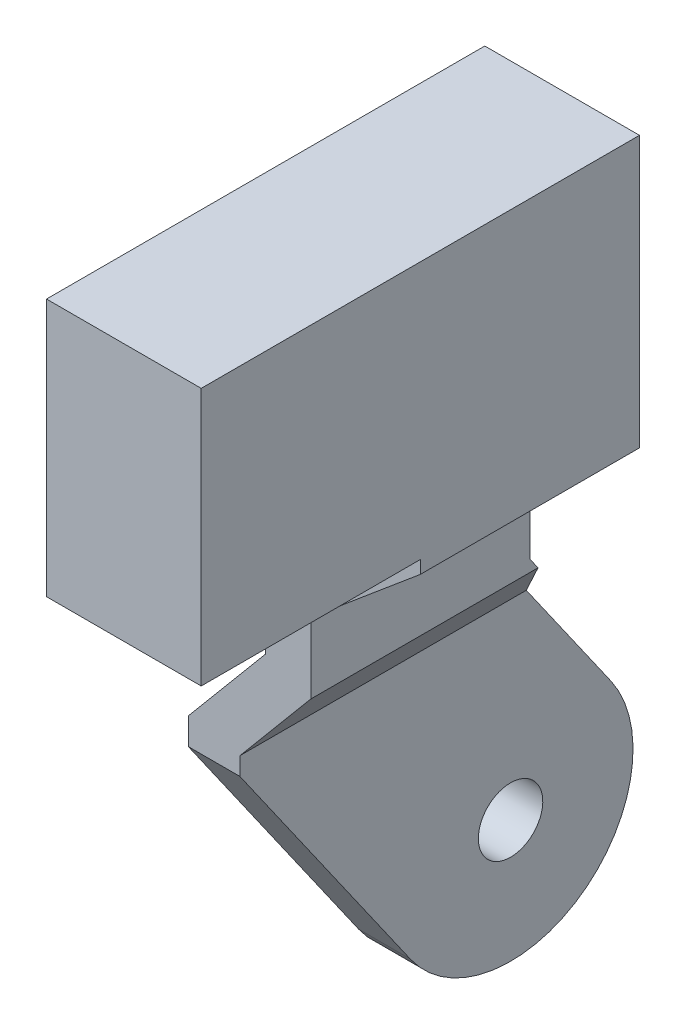
ISO-10303-21;
HEADER;
FILE_DESCRIPTION(('STEP AP214'),'2;1');
FILE_NAME('part.step','',(''),(''),'','','');
FILE_SCHEMA(('AUTOMOTIVE_DESIGN { 1 0 10303 214 1 1 1 1 }'));
ENDSEC;
DATA;
#1=APPLICATION_CONTEXT('core data for automotive mechanical design processes');
#2=APPLICATION_PROTOCOL_DEFINITION('international standard','automotive_design',2000,#1);
#3=PRODUCT_CONTEXT('',#1,'mechanical');
#4=PRODUCT('Part','Part','',(#3));
#5=PRODUCT_RELATED_PRODUCT_CATEGORY('part','',(#4));
#6=PRODUCT_DEFINITION_FORMATION('','',#4);
#7=PRODUCT_DEFINITION_CONTEXT('part definition',#1,'design');
#8=PRODUCT_DEFINITION('design','',#6,#7);
#9=PRODUCT_DEFINITION_SHAPE('','',#8);
#10=(LENGTH_UNIT() NAMED_UNIT(*) SI_UNIT(.MILLI.,.METRE.));
#11=(NAMED_UNIT(*) PLANE_ANGLE_UNIT() SI_UNIT($,.RADIAN.));
#12=(NAMED_UNIT(*) SI_UNIT($,.STERADIAN.) SOLID_ANGLE_UNIT());
#13=UNCERTAINTY_MEASURE_WITH_UNIT(LENGTH_MEASURE(1.E-05),#10,'distance_accuracy_value','');
#14=(GEOMETRIC_REPRESENTATION_CONTEXT(3) GLOBAL_UNCERTAINTY_ASSIGNED_CONTEXT((#13)) GLOBAL_UNIT_ASSIGNED_CONTEXT((#10,
#11,#12)) REPRESENTATION_CONTEXT('',''));
#15=CARTESIAN_POINT('',(0.,0.,0.));
#16=DIRECTION('',(0.,0.,1.));
#17=DIRECTION('',(1.,0.,0.));
#18=AXIS2_PLACEMENT_3D('',#15,#16,#17);
#19=CARTESIAN_POINT('',(20.,226.505215555653,-225.));
#20=DIRECTION('',(-1.,0.,0.));
#21=DIRECTION('',(0.,0.,1.));
#22=AXIS2_PLACEMENT_3D('',#19,#20,#21);
#23=PLANE('',#22);
#24=DIRECTION('',(0.,-1.,0.));
#25=VECTOR('',#24,1.);
#26=CARTESIAN_POINT('',(20.,350.,210.));
#27=LINE('',#26,#25);
#28=CARTESIAN_POINT('',(20.,350.,210.));
#29=VERTEX_POINT('',#28);
#30=CARTESIAN_POINT('',(20.,226.505215555653,210.));
#31=VERTEX_POINT('',#30);
#32=EDGE_CURVE('E52',#29,#31,#27,.T.);
#33=ORIENTED_EDGE('',*,*,#32,.F.);
#34=DIRECTION('',(0.,0.,-1.));
#35=VECTOR('',#34,1.);
#36=CARTESIAN_POINT('',(20.,350.,380.));
#37=LINE('',#36,#35);
#38=CARTESIAN_POINT('',(20.,350.,380.));
#39=VERTEX_POINT('',#38);
#40=EDGE_CURVE('E60',#39,#29,#37,.T.);
#41=ORIENTED_EDGE('',*,*,#40,.F.);
#42=DIRECTION('',(0.,-1.,0.));
#43=VECTOR('',#42,1.);
#44=CARTESIAN_POINT('',(20.,550.,380.));
#45=LINE('',#44,#43);
#46=CARTESIAN_POINT('',(20.,550.,380.));
#47=VERTEX_POINT('',#46);
#48=EDGE_CURVE('E314',#47,#39,#45,.T.);
#49=ORIENTED_EDGE('',*,*,#48,.F.);
#50=DIRECTION('',(0.,0.,1.));
#51=VECTOR('',#50,1.);
#52=CARTESIAN_POINT('',(20.,550.,-225.));
#53=LINE('',#52,#51);
#54=CARTESIAN_POINT('',(20.,550.,40.));
#55=VERTEX_POINT('',#54);
#56=EDGE_CURVE('E330',#55,#47,#53,.T.);
#57=ORIENTED_EDGE('',*,*,#56,.F.);
#58=DIRECTION('',(0.,1.,0.));
#59=VECTOR('',#58,1.);
#60=CARTESIAN_POINT('',(20.,222.753365853687,40.));
#61=LINE('',#60,#59);
#62=CARTESIAN_POINT('',(20.,226.505215555653,40.));
#63=VERTEX_POINT('',#62);
#64=EDGE_CURVE('E12',#63,#55,#61,.T.);
#65=ORIENTED_EDGE('',*,*,#64,.F.);
#66=DIRECTION('',(0.,0.,1.));
#67=VECTOR('',#66,1.);
#68=CARTESIAN_POINT('',(20.,226.505215555653,-225.));
#69=LINE('',#68,#67);
#70=EDGE_CURVE('E328',#63,#31,#69,.T.);
#71=ORIENTED_EDGE('',*,*,#70,.T.);
#72=EDGE_LOOP('',(#33,#41,#49,#57,#65,#71));
#73=FACE_BOUND('',#72,.T.);
#74=CARTESIAN_POINT('',(20.,260.,85.0000000000025));
#75=DIRECTION('',(-1.,0.,0.));
#76=DIRECTION('',(0.,0.,1.));
#77=AXIS2_PLACEMENT_3D('',#74,#75,#76);
#78=CIRCLE('',#77,10.);
#79=CARTESIAN_POINT('',(20.,260.,95.0000000000025));
#80=VERTEX_POINT('',#79);
#81=EDGE_CURVE('E39',#80,#80,#78,.T.);
#82=ORIENTED_EDGE('',*,*,#81,.F.);
#83=EDGE_LOOP('',(#82));
#84=FACE_BOUND('',#83,.T.);
#85=ADVANCED_FACE('F35',(#73,#84),#23,.T.);
#86=CARTESIAN_POINT('',(-40.,0.,0.));
#87=DIRECTION('',(1.,0.,0.));
#88=DIRECTION('',(0.,0.,-1.));
#89=AXIS2_PLACEMENT_3D('',#86,#87,#88);
#90=CYLINDRICAL_SURFACE('',#89,95.);
#91=DIRECTION('',(1.,0.,0.));
#92=VECTOR('',#91,1.);
#93=CARTESIAN_POINT('',(-40.,54.4897614533498,-77.8194442074539));
#94=LINE('',#93,#92);
#95=CARTESIAN_POINT('',(-40.,54.4897614533498,-77.8194442074539));
#96=VERTEX_POINT('',#95);
#97=CARTESIAN_POINT('',(0.,54.4897614533498,-77.8194442074539));
#98=VERTEX_POINT('',#97);
#99=EDGE_CURVE('E181',#96,#98,#94,.T.);
#100=ORIENTED_EDGE('',*,*,#99,.T.);
#101=CARTESIAN_POINT('',(0.,0.,0.));
#102=DIRECTION('',(1.,0.,0.));
#103=DIRECTION('',(0.,1.,0.));
#104=AXIS2_PLACEMENT_3D('',#101,#102,#103);
#105=CIRCLE('',#104,95.);
#106=CARTESIAN_POINT('',(0.,-54.4897614533498,77.8194442074539));
#107=VERTEX_POINT('',#106);
#108=EDGE_CURVE('E299',#98,#107,#105,.F.);
#109=ORIENTED_EDGE('',*,*,#108,.T.);
#110=DIRECTION('',(1.,0.,0.));
#111=VECTOR('',#110,1.);
#112=CARTESIAN_POINT('',(-40.,-54.4897614533498,77.8194442074539));
#113=LINE('',#112,#111);
#114=CARTESIAN_POINT('',(-40.,-54.4897614533498,77.8194442074539));
#115=VERTEX_POINT('',#114);
#116=EDGE_CURVE('E151',#115,#107,#113,.T.);
#117=ORIENTED_EDGE('',*,*,#116,.F.);
#118=CARTESIAN_POINT('',(-40.,0.,0.));
#119=DIRECTION('',(1.,0.,0.));
#120=DIRECTION('',(0.,0.,-1.));
#121=AXIS2_PLACEMENT_3D('',#118,#119,#120);
#122=CIRCLE('',#121,95.);
#123=EDGE_CURVE('E166',#115,#96,#122,.T.);
#124=ORIENTED_EDGE('',*,*,#123,.T.);
#125=EDGE_LOOP('',(#100,#109,#117,#124));
#126=FACE_BOUND('',#125,.T.);
#127=ADVANCED_FACE('F226',(#126),#90,.T.);
#128=CARTESIAN_POINT('',(-40.,134.283635831838,210.));
#129=DIRECTION('',(0.,-0.57357643635105,0.819152044288989));
#130=DIRECTION('',(0.,-0.819152044288989,-0.57357643635105));
#131=AXIS2_PLACEMENT_3D('',#128,#129,#130);
#132=PLANE('',#131);
#133=ORIENTED_EDGE('',*,*,#116,.T.);
#134=DIRECTION('',(0.,0.819152044288989,0.57357643635105));
#135=VECTOR('',#134,1.);
#136=CARTESIAN_POINT('',(0.,134.283635831838,210.));
#137=LINE('',#136,#135);
#138=CARTESIAN_POINT('',(0.,134.283635831838,210.));
#139=VERTEX_POINT('',#138);
#140=EDGE_CURVE('E302',#107,#139,#137,.T.);
#141=ORIENTED_EDGE('',*,*,#140,.T.);
#142=DIRECTION('',(1.,0.,0.));
#143=VECTOR('',#142,1.);
#144=CARTESIAN_POINT('',(-40.,134.283635831838,210.));
#145=LINE('',#144,#143);
#146=CARTESIAN_POINT('',(-40.,134.283635831838,210.));
#147=VERTEX_POINT('',#146);
#148=EDGE_CURVE('E184',#147,#139,#145,.T.);
#149=ORIENTED_EDGE('',*,*,#148,.F.);
#150=DIRECTION('',(0.,-0.819152044288989,-0.57357643635105));
#151=VECTOR('',#150,1.);
#152=CARTESIAN_POINT('',(-40.,134.283635831838,210.));
#153=LINE('',#152,#151);
#154=EDGE_CURVE('E178',#147,#115,#153,.T.);
#155=ORIENTED_EDGE('',*,*,#154,.T.);
#156=EDGE_LOOP('',(#133,#141,#149,#155));
#157=FACE_BOUND('',#156,.T.);
#158=ADVANCED_FACE('F232',(#157),#132,.T.);
#159=CARTESIAN_POINT('',(-40.,350.,210.));
#160=DIRECTION('',(0.,0.,1.));
#161=DIRECTION('',(0.,-1.,0.));
#162=AXIS2_PLACEMENT_3D('',#159,#160,#161);
#163=PLANE('',#162);
#164=ORIENTED_EDGE('',*,*,#32,.T.);
#165=DIRECTION('',(-0.642787609686541,-0.766044443118977,0.));
#166=VECTOR('',#165,1.);
#167=CARTESIAN_POINT('',(56.0187559186903,269.430697322525,210.));
#168=LINE('',#167,#166);
#169=CARTESIAN_POINT('',(-40.,155.,210.));
#170=VERTEX_POINT('',#169);
#171=EDGE_CURVE('E294',#31,#170,#168,.T.);
#172=ORIENTED_EDGE('',*,*,#171,.T.);
#173=DIRECTION('',(0.,-1.,0.));
#174=VECTOR('',#173,1.);
#175=CARTESIAN_POINT('',(-40.,350.,210.));
#176=LINE('',#175,#174);
#177=EDGE_CURVE('E176',#170,#147,#176,.T.);
#178=ORIENTED_EDGE('',*,*,#177,.T.);
#179=ORIENTED_EDGE('',*,*,#148,.T.);
#180=DIRECTION('',(0.,1.,0.));
#181=VECTOR('',#180,1.);
#182=CARTESIAN_POINT('',(0.,350.,210.));
#183=LINE('',#182,#181);
#184=CARTESIAN_POINT('',(0.,148.219809763654,210.));
#185=VERTEX_POINT('',#184);
#186=EDGE_CURVE('E305',#139,#185,#183,.T.);
#187=ORIENTED_EDGE('',*,*,#186,.T.);
#188=DIRECTION('',(0.64278760968654,0.766044443118977,0.));
#189=VECTOR('',#188,1.);
#190=CARTESIAN_POINT('',(82.8303114278545,246.933130983497,210.));
#191=LINE('',#190,#189);
#192=CARTESIAN_POINT('',(55.,213.766257356336,210.));
#193=VERTEX_POINT('',#192);
#194=EDGE_CURVE('E308',#185,#193,#191,.T.);
#195=ORIENTED_EDGE('',*,*,#194,.T.);
#196=DIRECTION('',(0.,1.,0.));
#197=VECTOR('',#196,1.);
#198=CARTESIAN_POINT('',(55.,350.,210.));
#199=LINE('',#198,#197);
#200=CARTESIAN_POINT('',(55.,268.676531349931,210.));
#201=VERTEX_POINT('',#200);
#202=EDGE_CURVE('E158',#193,#201,#199,.T.);
#203=ORIENTED_EDGE('',*,*,#202,.T.);
#204=DIRECTION('',(0.76604444311898,0.642787609686538,0.));
#205=VECTOR('',#204,1.);
#206=CARTESIAN_POINT('',(39.295702775037,255.499061340567,210.));
#207=LINE('',#206,#205);
#208=CARTESIAN_POINT('',(140.,340.,210.));
#209=VERTEX_POINT('',#208);
#210=EDGE_CURVE('E142',#201,#209,#207,.T.);
#211=ORIENTED_EDGE('',*,*,#210,.T.);
#212=DIRECTION('',(0.,-1.,0.));
#213=VECTOR('',#212,1.);
#214=CARTESIAN_POINT('',(140.,350.,210.));
#215=LINE('',#214,#213);
#216=CARTESIAN_POINT('',(140.,350.,210.));
#217=VERTEX_POINT('',#216);
#218=EDGE_CURVE('E156',#217,#209,#215,.T.);
#219=ORIENTED_EDGE('',*,*,#218,.F.);
#220=DIRECTION('',(1.,0.,0.));
#221=VECTOR('',#220,1.);
#222=CARTESIAN_POINT('',(-40.,350.,210.));
#223=LINE('',#222,#221);
#224=EDGE_CURVE('E187',#29,#217,#223,.T.);
#225=ORIENTED_EDGE('',*,*,#224,.F.);
#226=EDGE_LOOP('',(#164,#172,#178,#179,#187,#195,#203,#211,#219,#225));
#227=FACE_BOUND('',#226,.T.);
#228=ADVANCED_FACE('F155',(#227),#163,.T.);
#229=CARTESIAN_POINT('',(-40.,350.,380.));
#230=DIRECTION('',(0.,-1.,0.));
#231=DIRECTION('',(0.,0.,-1.));
#232=AXIS2_PLACEMENT_3D('',#229,#230,#231);
#233=PLANE('',#232);
#234=DIRECTION('',(1.,0.,0.));
#235=VECTOR('',#234,1.);
#236=CARTESIAN_POINT('',(-40.,350.,380.));
#237=LINE('',#236,#235);
#238=CARTESIAN_POINT('',(140.,350.,380.));
#239=VERTEX_POINT('',#238);
#240=EDGE_CURVE('E189',#39,#239,#237,.T.);
#241=ORIENTED_EDGE('',*,*,#240,.F.);
#242=ORIENTED_EDGE('',*,*,#40,.T.);
#243=ORIENTED_EDGE('',*,*,#224,.T.);
#244=DIRECTION('',(0.,0.,-1.));
#245=VECTOR('',#244,1.);
#246=CARTESIAN_POINT('',(140.,350.,380.));
#247=LINE('',#246,#245);
#248=EDGE_CURVE('E165',#239,#217,#247,.T.);
#249=ORIENTED_EDGE('',*,*,#248,.F.);
#250=EDGE_LOOP('',(#241,#242,#243,#249));
#251=FACE_BOUND('',#250,.T.);
#252=ADVANCED_FACE('F264',(#251),#233,.T.);
#253=CARTESIAN_POINT('',(-40.,550.,380.));
#254=DIRECTION('',(0.,0.,1.));
#255=DIRECTION('',(0.,-1.,0.));
#256=AXIS2_PLACEMENT_3D('',#253,#254,#255);
#257=PLANE('',#256);
#258=DIRECTION('',(1.,0.,0.));
#259=VECTOR('',#258,1.);
#260=CARTESIAN_POINT('',(-40.,550.,380.));
#261=LINE('',#260,#259);
#262=CARTESIAN_POINT('',(140.,550.,380.));
#263=VERTEX_POINT('',#262);
#264=EDGE_CURVE('E191',#47,#263,#261,.T.);
#265=ORIENTED_EDGE('',*,*,#264,.F.);
#266=ORIENTED_EDGE('',*,*,#48,.T.);
#267=ORIENTED_EDGE('',*,*,#240,.T.);
#268=DIRECTION('',(0.,-1.,0.));
#269=VECTOR('',#268,1.);
#270=CARTESIAN_POINT('',(140.,550.,380.));
#271=LINE('',#270,#269);
#272=EDGE_CURVE('E170',#263,#239,#271,.T.);
#273=ORIENTED_EDGE('',*,*,#272,.F.);
#274=EDGE_LOOP('',(#265,#266,#267,#273));
#275=FACE_BOUND('',#274,.T.);
#276=ADVANCED_FACE('F267',(#275),#257,.T.);
#277=CARTESIAN_POINT('',(-40.,550.,40.));
#278=DIRECTION('',(0.,1.,0.));
#279=DIRECTION('',(0.,0.,1.));
#280=AXIS2_PLACEMENT_3D('',#277,#278,#279);
#281=PLANE('',#280);
#282=DIRECTION('',(1.,0.,0.));
#283=VECTOR('',#282,1.);
#284=CARTESIAN_POINT('',(-40.,550.,40.));
#285=LINE('',#284,#283);
#286=CARTESIAN_POINT('',(140.,550.,40.));
#287=VERTEX_POINT('',#286);
#288=EDGE_CURVE('E193',#55,#287,#285,.T.);
#289=ORIENTED_EDGE('',*,*,#288,.F.);
#290=ORIENTED_EDGE('',*,*,#56,.T.);
#291=ORIENTED_EDGE('',*,*,#264,.T.);
#292=DIRECTION('',(0.,0.,1.));
#293=VECTOR('',#292,1.);
#294=CARTESIAN_POINT('',(140.,550.,40.));
#295=LINE('',#294,#293);
#296=EDGE_CURVE('E320',#287,#263,#295,.T.);
#297=ORIENTED_EDGE('',*,*,#296,.F.);
#298=EDGE_LOOP('',(#289,#290,#291,#297));
#299=FACE_BOUND('',#298,.T.);
#300=ADVANCED_FACE('F270',(#299),#281,.T.);
#301=CARTESIAN_POINT('',(-40.,222.753365853687,40.));
#302=DIRECTION('',(0.,0.,-1.));
#303=DIRECTION('',(-1.,0.,0.));
#304=AXIS2_PLACEMENT_3D('',#301,#302,#303);
#305=PLANE('',#304);
#306=DIRECTION('',(1.,0.,0.));
#307=VECTOR('',#306,1.);
#308=CARTESIAN_POINT('',(-40.,222.753365853687,40.));
#309=LINE('',#308,#307);
#310=CARTESIAN_POINT('',(16.8518242988482,222.753365853687,40.));
#311=VERTEX_POINT('',#310);
#312=CARTESIAN_POINT('',(55.,222.753365853687,40.));
#313=VERTEX_POINT('',#312);
#314=EDGE_CURVE('E195',#311,#313,#309,.T.);
#315=ORIENTED_EDGE('',*,*,#314,.F.);
#316=DIRECTION('',(0.642787609686541,0.766044443118977,0.));
#317=VECTOR('',#316,1.);
#318=CARTESIAN_POINT('',(-6.63798000730822,194.75930718249,40.));
#319=LINE('',#318,#317);
#320=EDGE_CURVE('E292',#311,#63,#319,.T.);
#321=ORIENTED_EDGE('',*,*,#320,.T.);
#322=ORIENTED_EDGE('',*,*,#64,.T.);
#323=ORIENTED_EDGE('',*,*,#288,.T.);
#324=DIRECTION('',(0.,1.,0.));
#325=VECTOR('',#324,1.);
#326=CARTESIAN_POINT('',(140.,222.753365853687,40.));
#327=LINE('',#326,#325);
#328=CARTESIAN_POINT('',(140.,340.,40.));
#329=VERTEX_POINT('',#328);
#330=EDGE_CURVE('E318',#329,#287,#327,.T.);
#331=ORIENTED_EDGE('',*,*,#330,.F.);
#332=DIRECTION('',(-0.76604444311898,-0.642787609686538,0.));
#333=VECTOR('',#332,1.);
#334=CARTESIAN_POINT('',(-23.3610331509615,202.923817334289,40.));
#335=LINE('',#334,#333);
#336=CARTESIAN_POINT('',(55.,268.676531349931,40.));
#337=VERTEX_POINT('',#336);
#338=EDGE_CURVE('E145',#329,#337,#335,.T.);
#339=ORIENTED_EDGE('',*,*,#338,.T.);
#340=DIRECTION('',(0.,-1.,0.));
#341=VECTOR('',#340,1.);
#342=CARTESIAN_POINT('',(55.,222.753365853687,40.));
#343=LINE('',#342,#341);
#344=EDGE_CURVE('E310',#337,#313,#343,.T.);
#345=ORIENTED_EDGE('',*,*,#344,.T.);
#346=EDGE_LOOP('',(#315,#321,#322,#323,#331,#339,#345));
#347=FACE_BOUND('',#346,.T.);
#348=ADVANCED_FACE('F274',(#347),#305,.T.);
#349=CARTESIAN_POINT('',(-40.,54.4897614533498,-77.8194442074539));
#350=DIRECTION('',(0.,0.57357643635105,-0.819152044288989));
#351=DIRECTION('',(0.,0.819152044288989,0.57357643635105));
#352=AXIS2_PLACEMENT_3D('',#349,#350,#351);
#353=PLANE('',#352);
#354=DIRECTION('',(0.,0.819152044288989,0.57357643635105));
#355=VECTOR('',#354,1.);
#356=CARTESIAN_POINT('',(-40.,54.4897614533498,-77.8194442074539));
#357=LINE('',#356,#355);
#358=CARTESIAN_POINT('',(-40.,155.,-7.44141750983249));
#359=VERTEX_POINT('',#358);
#360=EDGE_CURVE('E168',#96,#359,#357,.T.);
#361=ORIENTED_EDGE('',*,*,#360,.T.);
#362=DIRECTION('',(0.566444979584274,0.67506283942651,0.472684088931698));
#363=VECTOR('',#362,1.);
#364=CARTESIAN_POINT('',(-97.2773871919136,86.7394680396276,-55.2379565506907));
#365=LINE('',#364,#363);
#366=EDGE_CURVE('E159',#359,#311,#365,.T.);
#367=ORIENTED_EDGE('',*,*,#366,.T.);
#368=ORIENTED_EDGE('',*,*,#314,.T.);
#369=DIRECTION('',(0.,-0.819152044288989,-0.57357643635105));
#370=VECTOR('',#369,1.);
#371=CARTESIAN_POINT('',(55.,54.4897614533498,-77.8194442074539));
#372=LINE('',#371,#370);
#373=CARTESIAN_POINT('',(55.,213.766257356336,33.7071588834457));
#374=VERTEX_POINT('',#373);
#375=EDGE_CURVE('E44',#313,#374,#372,.T.);
#376=ORIENTED_EDGE('',*,*,#375,.T.);
#377=DIRECTION('',(-0.566444979584274,-0.67506283942651,-0.472684088931699));
#378=VECTOR('',#377,1.);
#379=CARTESIAN_POINT('',(-66.2479825768863,69.2685385255313,-67.4712330959915));
#380=LINE('',#379,#378);
#381=CARTESIAN_POINT('',(0.,148.219809763654,-12.188957823818));
#382=VERTEX_POINT('',#381);
#383=EDGE_CURVE('E205',#374,#382,#380,.T.);
#384=ORIENTED_EDGE('',*,*,#383,.T.);
#385=DIRECTION('',(0.,-0.819152044288989,-0.57357643635105));
#386=VECTOR('',#385,1.);
#387=CARTESIAN_POINT('',(0.,54.4897614533498,-77.8194442074539));
#388=LINE('',#387,#386);
#389=EDGE_CURVE('E202',#382,#98,#388,.T.);
#390=ORIENTED_EDGE('',*,*,#389,.T.);
#391=ORIENTED_EDGE('',*,*,#99,.F.);
#392=EDGE_LOOP('',(#361,#367,#368,#376,#384,#390,#391));
#393=FACE_BOUND('',#392,.T.);
#394=ADVANCED_FACE('F257',(#393),#353,.T.);
#395=CARTESIAN_POINT('',(-40.,0.,0.));
#396=DIRECTION('',(1.,0.,0.));
#397=DIRECTION('',(0.,0.,-1.));
#398=AXIS2_PLACEMENT_3D('',#395,#396,#397);
#399=PLANE('',#398);
#400=CARTESIAN_POINT('',(-40.,0.,0.));
#401=DIRECTION('',(-1.,0.,0.));
#402=DIRECTION('',(0.,0.,1.));
#403=AXIS2_PLACEMENT_3D('',#400,#401,#402);
#404=CIRCLE('',#403,25.);
#405=CARTESIAN_POINT('',(-40.,0.,25.));
#406=VERTEX_POINT('',#405);
#407=EDGE_CURVE('E212',#406,#406,#404,.T.);
#408=ORIENTED_EDGE('',*,*,#407,.F.);
#409=EDGE_LOOP('',(#408));
#410=FACE_BOUND('',#409,.T.);
#411=DIRECTION('',(0.,0.,1.));
#412=VECTOR('',#411,1.);
#413=CARTESIAN_POINT('',(-40.,155.,0.));
#414=LINE('',#413,#412);
#415=EDGE_CURVE('E150',#359,#170,#414,.T.);
#416=ORIENTED_EDGE('',*,*,#415,.F.);
#417=ORIENTED_EDGE('',*,*,#360,.F.);
#418=ORIENTED_EDGE('',*,*,#123,.F.);
#419=ORIENTED_EDGE('',*,*,#154,.F.);
#420=ORIENTED_EDGE('',*,*,#177,.F.);
#421=EDGE_LOOP('',(#416,#417,#418,#419,#420));
#422=FACE_BOUND('',#421,.T.);
#423=ADVANCED_FACE('F254',(#410,#422),#399,.F.);
#424=CARTESIAN_POINT('',(140.,0.,0.));
#425=DIRECTION('',(1.,0.,0.));
#426=DIRECTION('',(0.,0.,-1.));
#427=AXIS2_PLACEMENT_3D('',#424,#425,#426);
#428=PLANE('',#427);
#429=ORIENTED_EDGE('',*,*,#218,.T.);
#430=DIRECTION('',(0.,0.,-1.));
#431=VECTOR('',#430,1.);
#432=CARTESIAN_POINT('',(140.,340.,0.));
#433=LINE('',#432,#431);
#434=EDGE_CURVE('E138',#209,#329,#433,.T.);
#435=ORIENTED_EDGE('',*,*,#434,.T.);
#436=ORIENTED_EDGE('',*,*,#330,.T.);
#437=ORIENTED_EDGE('',*,*,#296,.T.);
#438=ORIENTED_EDGE('',*,*,#272,.T.);
#439=ORIENTED_EDGE('',*,*,#248,.T.);
#440=EDGE_LOOP('',(#429,#435,#436,#437,#438,#439));
#441=FACE_BOUND('',#440,.T.);
#442=ADVANCED_FACE('F162',(#441),#428,.T.);
#443=CARTESIAN_POINT('',(55.,268.676531349931,-225.));
#444=DIRECTION('',(0.642787609686538,-0.76604444311898,0.));
#445=DIRECTION('',(0.76604444311898,0.642787609686538,0.));
#446=AXIS2_PLACEMENT_3D('',#443,#444,#445);
#447=PLANE('',#446);
#448=ORIENTED_EDGE('',*,*,#210,.F.);
#449=DIRECTION('',(0.,0.,1.));
#450=VECTOR('',#449,1.);
#451=CARTESIAN_POINT('',(55.,268.676531349931,-225.));
#452=LINE('',#451,#450);
#453=EDGE_CURVE('E332',#337,#201,#452,.T.);
#454=ORIENTED_EDGE('',*,*,#453,.F.);
#455=ORIENTED_EDGE('',*,*,#338,.F.);
#456=ORIENTED_EDGE('',*,*,#434,.F.);
#457=EDGE_LOOP('',(#448,#454,#455,#456));
#458=FACE_BOUND('',#457,.T.);
#459=ADVANCED_FACE('F140',(#458),#447,.T.);
#460=CARTESIAN_POINT('',(0.,-95.,-225.));
#461=DIRECTION('',(1.,0.,0.));
#462=DIRECTION('',(0.,1.,0.));
#463=AXIS2_PLACEMENT_3D('',#460,#461,#462);
#464=PLANE('',#463);
#465=CARTESIAN_POINT('',(0.,0.,0.));
#466=DIRECTION('',(1.,0.,0.));
#467=DIRECTION('',(0.,1.,0.));
#468=AXIS2_PLACEMENT_3D('',#465,#466,#467);
#469=CIRCLE('',#468,25.);
#470=CARTESIAN_POINT('',(0.,25.,0.));
#471=VERTEX_POINT('',#470);
#472=EDGE_CURVE('E210',#471,#471,#469,.T.);
#473=ORIENTED_EDGE('',*,*,#472,.F.);
#474=EDGE_LOOP('',(#473));
#475=FACE_BOUND('',#474,.T.);
#476=ORIENTED_EDGE('',*,*,#186,.F.);
#477=ORIENTED_EDGE('',*,*,#140,.F.);
#478=ORIENTED_EDGE('',*,*,#108,.F.);
#479=ORIENTED_EDGE('',*,*,#389,.F.);
#480=DIRECTION('',(0.,0.,1.));
#481=VECTOR('',#480,1.);
#482=CARTESIAN_POINT('',(0.,148.219809763654,-225.));
#483=LINE('',#482,#481);
#484=EDGE_CURVE('E215',#382,#185,#483,.T.);
#485=ORIENTED_EDGE('',*,*,#484,.T.);
#486=EDGE_LOOP('',(#476,#477,#478,#479,#485));
#487=FACE_BOUND('',#486,.T.);
#488=ADVANCED_FACE('F240',(#475,#487),#464,.T.);
#489=CARTESIAN_POINT('',(0.,148.219809763654,-225.));
#490=DIRECTION('',(0.766044443118977,-0.64278760968654,0.));
#491=DIRECTION('',(0.64278760968654,0.766044443118977,0.));
#492=AXIS2_PLACEMENT_3D('',#489,#490,#491);
#493=PLANE('',#492);
#494=ORIENTED_EDGE('',*,*,#194,.F.);
#495=ORIENTED_EDGE('',*,*,#484,.F.);
#496=ORIENTED_EDGE('',*,*,#383,.F.);
#497=DIRECTION('',(0.,0.,1.));
#498=VECTOR('',#497,1.);
#499=CARTESIAN_POINT('',(55.,213.766257356336,-225.));
#500=LINE('',#499,#498);
#501=EDGE_CURVE('E219',#374,#193,#500,.T.);
#502=ORIENTED_EDGE('',*,*,#501,.T.);
#503=EDGE_LOOP('',(#494,#495,#496,#502));
#504=FACE_BOUND('',#503,.T.);
#505=ADVANCED_FACE('F244',(#504),#493,.T.);
#506=CARTESIAN_POINT('',(55.,213.766257356336,-225.));
#507=DIRECTION('',(1.,0.,0.));
#508=DIRECTION('',(0.,0.,-1.));
#509=AXIS2_PLACEMENT_3D('',#506,#507,#508);
#510=PLANE('',#509);
#511=ORIENTED_EDGE('',*,*,#202,.F.);
#512=ORIENTED_EDGE('',*,*,#501,.F.);
#513=ORIENTED_EDGE('',*,*,#375,.F.);
#514=ORIENTED_EDGE('',*,*,#344,.F.);
#515=ORIENTED_EDGE('',*,*,#453,.T.);
#516=EDGE_LOOP('',(#511,#512,#513,#514,#515));
#517=FACE_BOUND('',#516,.T.);
#518=ADVANCED_FACE('F241',(#517),#510,.T.);
#519=CARTESIAN_POINT('',(20.,226.505215555653,-225.));
#520=DIRECTION('',(-0.766044443118977,0.642787609686541,0.));
#521=DIRECTION('',(-0.642787609686541,-0.766044443118977,0.));
#522=AXIS2_PLACEMENT_3D('',#519,#520,#521);
#523=PLANE('',#522);
#524=ORIENTED_EDGE('',*,*,#171,.F.);
#525=ORIENTED_EDGE('',*,*,#70,.F.);
#526=ORIENTED_EDGE('',*,*,#320,.F.);
#527=ORIENTED_EDGE('',*,*,#366,.F.);
#528=ORIENTED_EDGE('',*,*,#415,.T.);
#529=EDGE_LOOP('',(#524,#525,#526,#527,#528));
#530=FACE_BOUND('',#529,.T.);
#531=ADVANCED_FACE('F236',(#530),#523,.T.);
#532=CARTESIAN_POINT('',(-40.,260.,85.0000000000025));
#533=DIRECTION('',(1.,0.,0.));
#534=DIRECTION('',(0.,0.,-1.));
#535=AXIS2_PLACEMENT_3D('',#532,#533,#534);
#536=CYLINDRICAL_SURFACE('',#535,10.);
#537=CARTESIAN_POINT('',(-40.,260.,85.0000000000025));
#538=DIRECTION('',(-1.,0.,0.));
#539=DIRECTION('',(0.,0.,1.));
#540=AXIS2_PLACEMENT_3D('',#537,#538,#539);
#541=CIRCLE('',#540,10.);
#542=CARTESIAN_POINT('',(-40.,260.,95.0000000000025));
#543=VERTEX_POINT('',#542);
#544=EDGE_CURVE('E213',#543,#543,#541,.T.);
#545=ORIENTED_EDGE('',*,*,#544,.F.);
#546=EDGE_LOOP('',(#545));
#547=FACE_BOUND('',#546,.T.);
#548=ORIENTED_EDGE('',*,*,#81,.T.);
#549=EDGE_LOOP('',(#548));
#550=FACE_BOUND('',#549,.T.);
#551=ADVANCED_FACE('F37',(#547,#550),#536,.T.);
#552=CARTESIAN_POINT('',(-40.,260.,150.000000000003));
#553=DIRECTION('',(-1.,0.,0.));
#554=DIRECTION('',(0.,0.,1.));
#555=AXIS2_PLACEMENT_3D('',#552,#553,#554);
#556=PLANE('',#555);
#557=ORIENTED_EDGE('',*,*,#544,.T.);
#558=EDGE_LOOP('',(#557));
#559=FACE_BOUND('',#558,.T.);
#560=ADVANCED_FACE('F349',(#559),#556,.T.);
#561=CARTESIAN_POINT('',(140.,0.,0.));
#562=DIRECTION('',(-1.,0.,0.));
#563=DIRECTION('',(0.,0.,1.));
#564=AXIS2_PLACEMENT_3D('',#561,#562,#563);
#565=CYLINDRICAL_SURFACE('',#564,25.);
#566=ORIENTED_EDGE('',*,*,#472,.T.);
#567=EDGE_LOOP('',(#566));
#568=FACE_BOUND('',#567,.T.);
#569=ORIENTED_EDGE('',*,*,#407,.T.);
#570=EDGE_LOOP('',(#569));
#571=FACE_BOUND('',#570,.T.);
#572=ADVANCED_FACE('F347',(#568,#571),#565,.F.);
#573=CLOSED_SHELL('',(#85,#127,#158,#228,#252,#276,#300,#348,#394,#423,#442,#459,#488,#505,#518,
#531,#551,#560,#572));
#574=MANIFOLD_SOLID_BREP('B2',#573);
#575=ADVANCED_BREP_SHAPE_REPRESENTATION('',(#18,#574),#14);
#576=SHAPE_DEFINITION_REPRESENTATION(#9,#575);
ENDSEC;
END-ISO-10303-21;
